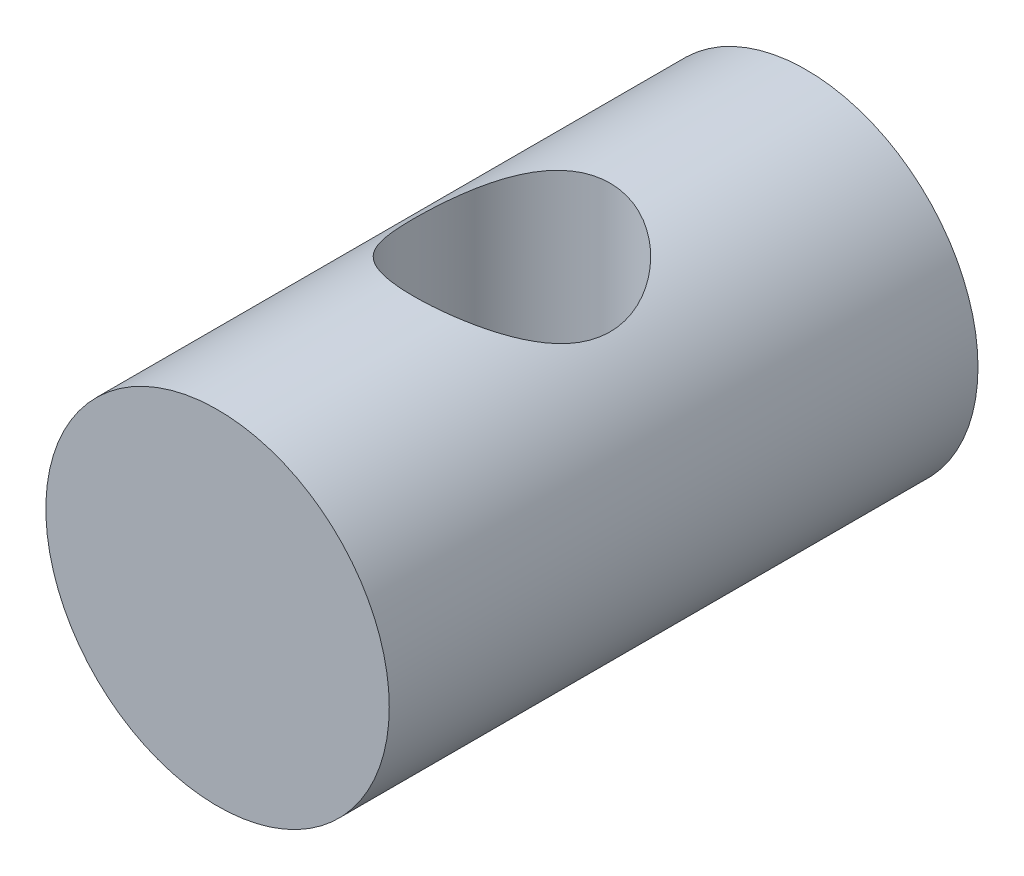
ISO-10303-21;
HEADER;
FILE_DESCRIPTION(('STEP AP214'),'2;1');
FILE_NAME('part.step','',(''),(''),'','','');
FILE_SCHEMA(('AUTOMOTIVE_DESIGN { 1 0 10303 214 1 1 1 1 }'));
ENDSEC;
DATA;
#1=APPLICATION_CONTEXT('core data for automotive mechanical design processes');
#2=APPLICATION_PROTOCOL_DEFINITION('international standard','automotive_design',2000,#1);
#3=PRODUCT_CONTEXT('',#1,'mechanical');
#4=PRODUCT('Part','Part','',(#3));
#5=PRODUCT_RELATED_PRODUCT_CATEGORY('part','',(#4));
#6=PRODUCT_DEFINITION_FORMATION('','',#4);
#7=PRODUCT_DEFINITION_CONTEXT('part definition',#1,'design');
#8=PRODUCT_DEFINITION('design','',#6,#7);
#9=PRODUCT_DEFINITION_SHAPE('','',#8);
#10=(LENGTH_UNIT() NAMED_UNIT(*) SI_UNIT(.MILLI.,.METRE.));
#11=(NAMED_UNIT(*) PLANE_ANGLE_UNIT() SI_UNIT($,.RADIAN.));
#12=(NAMED_UNIT(*) SI_UNIT($,.STERADIAN.) SOLID_ANGLE_UNIT());
#13=UNCERTAINTY_MEASURE_WITH_UNIT(LENGTH_MEASURE(1.E-05),#10,'distance_accuracy_value','');
#14=(GEOMETRIC_REPRESENTATION_CONTEXT(3) GLOBAL_UNCERTAINTY_ASSIGNED_CONTEXT((#13)) GLOBAL_UNIT_ASSIGNED_CONTEXT((#10,
#11,#12)) REPRESENTATION_CONTEXT('',''));
#15=CARTESIAN_POINT('',(0.,0.,0.));
#16=DIRECTION('',(0.,0.,1.));
#17=DIRECTION('',(1.,0.,0.));
#18=AXIS2_PLACEMENT_3D('',#15,#16,#17);
#19=CARTESIAN_POINT('',(0.,0.,0.));
#20=DIRECTION('',(0.,0.,-1.));
#21=DIRECTION('',(-1.,0.,0.));
#22=AXIS2_PLACEMENT_3D('',#19,#20,#21);
#23=PLANE('',#22);
#24=CARTESIAN_POINT('',(3.5,3.5,0.));
#25=DIRECTION('',(0.,0.,1.));
#26=DIRECTION('',(1.,0.,0.));
#27=AXIS2_PLACEMENT_3D('',#24,#25,#26);
#28=CIRCLE('',#27,3.5);
#29=CARTESIAN_POINT('',(7.,3.5,0.));
#30=VERTEX_POINT('',#29);
#31=EDGE_CURVE('E18',#30,#30,#28,.T.);
#32=ORIENTED_EDGE('',*,*,#31,.F.);
#33=EDGE_LOOP('',(#32));
#34=FACE_BOUND('',#33,.T.);
#35=ADVANCED_FACE('F15',(#34),#23,.T.);
#36=CARTESIAN_POINT('',(0.,0.,12.));
#37=DIRECTION('',(0.,0.,-1.));
#38=DIRECTION('',(-1.,0.,0.));
#39=AXIS2_PLACEMENT_3D('',#36,#37,#38);
#40=PLANE('',#39);
#41=CARTESIAN_POINT('',(3.5,3.5,12.));
#42=DIRECTION('',(0.,0.,1.));
#43=DIRECTION('',(1.,0.,0.));
#44=AXIS2_PLACEMENT_3D('',#41,#42,#43);
#45=CIRCLE('',#44,3.5);
#46=CARTESIAN_POINT('',(7.,3.5,12.));
#47=VERTEX_POINT('',#46);
#48=EDGE_CURVE('E22',#47,#47,#45,.F.);
#49=ORIENTED_EDGE('',*,*,#48,.F.);
#50=EDGE_LOOP('',(#49));
#51=FACE_BOUND('',#50,.T.);
#52=ADVANCED_FACE('F49',(#51),#40,.F.);
#53=CARTESIAN_POINT('',(3.5,0.,6.));
#54=DIRECTION('',(0.,1.,0.));
#55=DIRECTION('',(-1.,0.,0.));
#56=AXIS2_PLACEMENT_3D('',#53,#54,#55);
#57=CYLINDRICAL_SURFACE('',#56,2.);
#58=CARTESIAN_POINT('',(1.5,6.37228132326901,6.));
#59=CARTESIAN_POINT('',(1.50000204422436,6.37228454712099,5.89824071697675));
#60=CARTESIAN_POINT('',(1.50781480729771,6.37777067623112,5.79646672831802));
#61=CARTESIAN_POINT('',(1.53855068921281,6.39880046688832,5.59626540463563));
#62=CARTESIAN_POINT('',(1.561489919302,6.41435485184119,5.49784175574432));
#63=CARTESIAN_POINT('',(1.62103942346786,6.45309076236742,5.30762149928021));
#64=CARTESIAN_POINT('',(1.65756096882659,6.47622267211548,5.21578639695527));
#65=CARTESIAN_POINT('',(1.74295746322381,6.52742059167266,5.03958400081872));
#66=CARTESIAN_POINT('',(1.79183637209649,6.55548818220821,4.95521911251005));
#67=CARTESIAN_POINT('',(1.90682478661917,6.61712928824724,4.78618065877169));
#68=CARTESIAN_POINT('',(1.97423679288889,6.65096898375113,4.70248993469339));
#69=CARTESIAN_POINT('',(2.12169611861921,6.71820634481925,4.54680209211825));
#70=CARTESIAN_POINT('',(2.2017515979543,6.75160370971936,4.47481258668842));
#71=CARTESIAN_POINT('',(2.38145839728527,6.81796239643438,4.33783291507044));
#72=CARTESIAN_POINT('',(2.48224822167357,6.85058180751117,4.27415457176005));
#73=CARTESIAN_POINT('',(2.69532803941119,6.90802542898886,4.16511913000374));
#74=CARTESIAN_POINT('',(2.80760842968622,6.93285607930473,4.11974688674696));
#75=CARTESIAN_POINT('',(3.02998372064131,6.96996336372305,4.05286189960639));
#76=CARTESIAN_POINT('',(3.13939419402545,6.98315582593062,4.02959435836294));
#77=CARTESIAN_POINT('',(3.36128628788376,6.99901289726841,4.00169299604949));
#78=CARTESIAN_POINT('',(3.47376528230619,7.00168624068257,3.99704371572109));
#79=CARTESIAN_POINT('',(3.6849469637876,6.99652510240883,4.00608689983999));
#80=CARTESIAN_POINT('',(3.78377257716738,6.98984178265963,4.01776975643836));
#81=CARTESIAN_POINT('',(3.97777928272136,6.9686091056649,4.05539452444678));
#82=CARTESIAN_POINT('',(4.07296010622607,6.95405916973575,4.0813374848602));
#83=CARTESIAN_POINT('',(4.25817849675909,6.91820908135194,4.14665099229667));
#84=CARTESIAN_POINT('',(4.34816287736819,6.89685012587018,4.1861387474121));
#85=CARTESIAN_POINT('',(4.52037827753867,6.84915268765435,4.27711784116995));
#86=CARTESIAN_POINT('',(4.60260700085174,6.8228127370703,4.32861271923772));
#87=CARTESIAN_POINT('',(4.76692918495856,6.76394555274582,4.44874592127863));
#88=CARTESIAN_POINT('',(4.84795656029944,6.73105548059221,4.5186641582258));
#89=CARTESIAN_POINT('',(4.99778980682765,6.66439037140551,4.67033465934113));
#90=CARTESIAN_POINT('',(5.06658064643715,6.63061430362079,4.75210125765267));
#91=CARTESIAN_POINT('',(5.19686219905414,6.56212243151114,4.93488022288358));
#92=CARTESIAN_POINT('',(5.25694261459508,6.52764831081433,5.03699844156409));
#93=CARTESIAN_POINT('',(5.35868169503534,6.46628701949477,5.25207752591313));
#94=CARTESIAN_POINT('',(5.40037300071843,6.43938643675613,5.36501874323717));
#95=CARTESIAN_POINT('',(5.455874001455,6.40265362950898,5.57190959062671));
#96=CARTESIAN_POINT('',(5.47388069289566,6.39032428676995,5.66429134217347));
#97=CARTESIAN_POINT('',(5.49669026146642,6.37461858134697,5.85138817084493));
#98=CARTESIAN_POINT('',(5.50150579796718,6.37123363495883,5.94610092278013));
#99=CARTESIAN_POINT('',(5.49766863089417,6.37390377719123,6.13516343212116));
#100=CARTESIAN_POINT('',(5.48900796355997,6.37996444770089,6.22951294183307));
#101=CARTESIAN_POINT('',(5.45870152807443,6.40065746980172,6.41514959645774));
#102=CARTESIAN_POINT('',(5.43704629977864,6.41529606600908,6.50643445910858));
#103=CARTESIAN_POINT('',(5.38140846842958,6.45150911798998,6.68495328166673));
#104=CARTESIAN_POINT('',(5.34727488278457,6.47316813748298,6.77212219472486));
#105=CARTESIAN_POINT('',(5.2678570298669,6.52106419530222,6.9398419588285));
#106=CARTESIAN_POINT('',(5.2225682138661,6.54730309987681,7.02039009222811));
#107=CARTESIAN_POINT('',(5.11341400894957,6.60666399761926,7.18674731846636));
#108=CARTESIAN_POINT('',(5.047711996041,6.64020508074668,7.27120471486999));
#109=CARTESIAN_POINT('',(4.90365915117369,6.70718874482692,7.42868572125834));
#110=CARTESIAN_POINT('',(4.82529785443659,6.7406312207748,7.50169977238414));
#111=CARTESIAN_POINT('',(4.64867494696647,6.80761562311545,7.64147873905662));
#112=CARTESIAN_POINT('',(4.54920745926283,6.84083391107345,7.70689126341776));
#113=CARTESIAN_POINT('',(4.3385020489031,6.89983021540636,7.81965844723343));
#114=CARTESIAN_POINT('',(4.22727351775958,6.92561410793537,7.86702737792577));
#115=CARTESIAN_POINT('',(4.00569756822567,6.96494999115133,7.93821642470346));
#116=CARTESIAN_POINT('',(3.89601614617711,6.97932715272067,7.96364021417987));
#117=CARTESIAN_POINT('',(3.67311053252493,6.99749840717713,7.99566463319743));
#118=CARTESIAN_POINT('',(3.55988956247567,7.00130185566164,8.00228190282047));
#119=CARTESIAN_POINT('',(3.34733655361185,6.99809507365951,7.99666299303595));
#120=CARTESIAN_POINT('',(3.24792181893597,6.99229198229475,7.9865316276306));
#121=CARTESIAN_POINT('',(3.05248357562681,6.97266080925366,7.95181414035172));
#122=CARTESIAN_POINT('',(2.95646024505919,6.95883230686572,7.92722726068401));
#123=CARTESIAN_POINT('',(2.77005937308171,6.92435356756848,7.86463874091232));
#124=CARTESIAN_POINT('',(2.67969138830913,6.90369213555968,7.8266150788745));
#125=CARTESIAN_POINT('',(2.5065023650872,6.85723286822269,7.73850860831676));
#126=CARTESIAN_POINT('',(2.42368340065645,6.83143362749563,7.68842249944241));
#127=CARTESIAN_POINT('',(2.25817828832372,6.77358852163637,7.5713852762283));
#128=CARTESIAN_POINT('',(2.17650677822627,6.74116776373342,7.50318571721369));
#129=CARTESIAN_POINT('',(2.0251097769588,6.67514349361031,7.35496930487775));
#130=CARTESIAN_POINT('',(1.95539875065058,6.64153860767596,7.27493835746265));
#131=CARTESIAN_POINT('',(1.82253955101245,6.57282960146827,7.09538698398312));
#132=CARTESIAN_POINT('',(1.76084083878918,6.53793640760435,6.99470355515741));
#133=CARTESIAN_POINT('',(1.65555350731888,6.47519675497847,6.78230817199374));
#134=CARTESIAN_POINT('',(1.61193523229337,6.44733878651354,6.67061465210016));
#135=CARTESIAN_POINT('',(1.55276863796529,6.4084776323925,6.46572576098033));
#136=CARTESIAN_POINT('',(1.53307181655259,6.39507162454789,6.3741836596729));
#137=CARTESIAN_POINT('',(1.50669262433316,6.37697604487482,6.18843019166413));
#138=CARTESIAN_POINT('',(1.49999810720285,6.37227833822592,6.09422139966692));
#139=CARTESIAN_POINT('',(1.5,6.37228132326901,6.));
#140=B_SPLINE_CURVE_WITH_KNOTS('',3,(#58,#59,#60,#61,#62,#63,#64,#65,#66,#67,#68,#69,#70,#71,
#72,#73,#74,#75,#76,#77,#78,#79,#80,#81,#82,#83,#84,#85,#86,#87,#88,#89,#90,#91,#92,#93,#94,#95,
#96,#97,#98,#99,#100,#101,#102,#103,#104,#105,#106,#107,#108,#109,#110,#111,#112,#113,#114,#115,
#116,#117,#118,#119,#120,#121,#122,#123,#124,#125,#126,#127,#128,#129,#130,#131,#132,#133,#134,
#135,#136,#137,#138,#139),.UNSPECIFIED.,.T.,.F.,(4,2,2,2,2,2,2,2,2,2,2,2,2,2,2,2,2,2,2,2,2,2,2,
2,2,2,2,2,2,2,2,2,2,2,2,2,2,2,2,2,4),(0.,0.304883874922046,0.610093008270222,0.913342368040703,
1.21668902547472,1.55333694497106,1.89020302568346,2.25902542597166,2.62754206720092,
2.96347760859663,3.29913415548684,3.59693222043896,3.89475219497793,4.1952171976663,
4.49577088279065,4.83030033345032,5.16523793001608,5.53354788734202,5.90120143518938,
6.18472748221689,6.46798133769669,6.75140264557764,7.03503053719285,7.32221037238044,
7.60950750428143,7.944568532569,8.27990796934229,8.64873850633052,9.01727671507228,
9.35580044793154,9.69402456028398,9.99288076018055,10.291752628263,10.591116615435,
10.8905626035456,11.222913671625,11.5556638903259,11.9232239861485,12.2901787962962,
12.572742293729,12.8550417024667),.UNSPECIFIED.);
#141=CARTESIAN_POINT('',(1.5,6.37228132326901,6.));
#142=VERTEX_POINT('',#141);
#143=EDGE_CURVE('E10',#142,#142,#140,.T.);
#144=ORIENTED_EDGE('',*,*,#143,.F.);
#145=EDGE_LOOP('',(#144));
#146=FACE_BOUND('',#145,.T.);
#147=CARTESIAN_POINT('',(1.5,0.627718676730986,6.));
#148=CARTESIAN_POINT('',(1.50000204422436,0.627715452879011,6.10175928302324));
#149=CARTESIAN_POINT('',(1.50781480729771,0.622229323768883,6.20353327168198));
#150=CARTESIAN_POINT('',(1.53855068921281,0.601199533111684,6.40373459536437));
#151=CARTESIAN_POINT('',(1.561489919302,0.585645148158808,6.50215824425567));
#152=CARTESIAN_POINT('',(1.62103942346786,0.546909237632575,6.69237850071979));
#153=CARTESIAN_POINT('',(1.65756096882659,0.523777327884521,6.78421360304473));
#154=CARTESIAN_POINT('',(1.74295746322381,0.472579408327338,6.96041599918128));
#155=CARTESIAN_POINT('',(1.7918363720965,0.444511817791786,7.04478088748995));
#156=CARTESIAN_POINT('',(1.90682478661917,0.382870711752763,7.21381934122831));
#157=CARTESIAN_POINT('',(1.9742367928889,0.349031016248865,7.29751006530661));
#158=CARTESIAN_POINT('',(2.12169611861921,0.281793655180749,7.45319790788175));
#159=CARTESIAN_POINT('',(2.2017515979543,0.248396290280642,7.52518741331158));
#160=CARTESIAN_POINT('',(2.38145839728527,0.182037603565623,7.66216708492956));
#161=CARTESIAN_POINT('',(2.48224822167357,0.149418192488832,7.72584542823994));
#162=CARTESIAN_POINT('',(2.69532803941119,0.0919745710111408,7.83488086999626));
#163=CARTESIAN_POINT('',(2.80760842968622,0.0671439206952661,7.88025311325304));
#164=CARTESIAN_POINT('',(3.02998372064131,0.0300366362769491,7.94713810039361));
#165=CARTESIAN_POINT('',(3.13939419402545,0.0168441740693796,7.97040564163706));
#166=CARTESIAN_POINT('',(3.36128628788376,0.0009871027315897,7.99830700395052));
#167=CARTESIAN_POINT('',(3.47376528230619,-0.00168624068257116,8.00295628427891));
#168=CARTESIAN_POINT('',(3.6849469637876,0.00347489759117274,7.99391310016001));
#169=CARTESIAN_POINT('',(3.78377257716738,0.0101582173403684,7.98223024356164));
#170=CARTESIAN_POINT('',(3.97777928272136,0.0313908943351044,7.94460547555322));
#171=CARTESIAN_POINT('',(4.07296010622607,0.0459408302642527,7.9186625151398));
#172=CARTESIAN_POINT('',(4.25817849675909,0.0817909186480617,7.85334900770332));
#173=CARTESIAN_POINT('',(4.34816287736819,0.103149874129818,7.8138612525879));
#174=CARTESIAN_POINT('',(4.52037827753867,0.150847312345655,7.72288215883005));
#175=CARTESIAN_POINT('',(4.60260700085174,0.1771872629297,7.67138728076228));
#176=CARTESIAN_POINT('',(4.76692918495856,0.236054447254184,7.55125407872137));
#177=CARTESIAN_POINT('',(4.84795656029944,0.268944519407786,7.4813358417742));
#178=CARTESIAN_POINT('',(4.99778980682765,0.335609628594487,7.32966534065887));
#179=CARTESIAN_POINT('',(5.06658064643715,0.369385696379208,7.24789874234733));
#180=CARTESIAN_POINT('',(5.19686219905414,0.437877568488861,7.06511977711642));
#181=CARTESIAN_POINT('',(5.25694261459508,0.472351689185667,6.96300155843591));
#182=CARTESIAN_POINT('',(5.35868169503534,0.533712980505228,6.74792247408687));
#183=CARTESIAN_POINT('',(5.40037300071843,0.560613563243871,6.63498125676283));
#184=CARTESIAN_POINT('',(5.455874001455,0.59734637049102,6.42809040937329));
#185=CARTESIAN_POINT('',(5.47388069289566,0.609675713230048,6.33570865782653));
#186=CARTESIAN_POINT('',(5.49669026146642,0.625381418653033,6.14861182915507));
#187=CARTESIAN_POINT('',(5.50150579796718,0.628766365041171,6.05389907721987));
#188=CARTESIAN_POINT('',(5.49766863089417,0.626096222808775,5.86483656787885));
#189=CARTESIAN_POINT('',(5.48900796355997,0.62003555229911,5.77048705816694));
#190=CARTESIAN_POINT('',(5.45870152807444,0.599342530198279,5.58485040354226));
#191=CARTESIAN_POINT('',(5.43704629977864,0.584703933990925,5.49356554089142));
#192=CARTESIAN_POINT('',(5.38140846842958,0.548490882010025,5.31504671833327));
#193=CARTESIAN_POINT('',(5.34727488278457,0.526831862517016,5.22787780527515));
#194=CARTESIAN_POINT('',(5.2678570298669,0.478935804697783,5.0601580411715));
#195=CARTESIAN_POINT('',(5.2225682138661,0.452696900123188,4.97960990777189));
#196=CARTESIAN_POINT('',(5.11341400894957,0.393336002380737,4.81325268153364));
#197=CARTESIAN_POINT('',(5.047711996041,0.359794919253318,4.72879528513001));
#198=CARTESIAN_POINT('',(4.90365915117369,0.292811255173081,4.57131427874166));
#199=CARTESIAN_POINT('',(4.82529785443659,0.2593687792252,4.49830022761586));
#200=CARTESIAN_POINT('',(4.64867494696647,0.192384376884551,4.35852126094338));
#201=CARTESIAN_POINT('',(4.54920745926284,0.159166088926553,4.29310873658225));
#202=CARTESIAN_POINT('',(4.3385020489031,0.100169784593638,4.18034155276657));
#203=CARTESIAN_POINT('',(4.22727351775958,0.0743858920646283,4.13297262207423));
#204=CARTESIAN_POINT('',(4.00569756822568,0.0350500088486742,4.06178357529654));
#205=CARTESIAN_POINT('',(3.89601614617712,0.0206728472793273,4.03635978582013));
#206=CARTESIAN_POINT('',(3.67311053252493,0.0025015928228664,4.00433536680257));
#207=CARTESIAN_POINT('',(3.55988956247568,-0.00130185566163553,3.99771809717953));
#208=CARTESIAN_POINT('',(3.34733655361186,0.00190492634048564,4.00333700696405));
#209=CARTESIAN_POINT('',(3.24792181893598,0.00770801770524531,4.0134683723694));
#210=CARTESIAN_POINT('',(3.05248357562682,0.0273391907463358,4.04818585964827));
#211=CARTESIAN_POINT('',(2.95646024505919,0.0411676931342755,4.07277273931599));
#212=CARTESIAN_POINT('',(2.77005937308171,0.0756464324315167,4.13536125908768));
#213=CARTESIAN_POINT('',(2.67969138830914,0.0963078644403169,4.1733849211255));
#214=CARTESIAN_POINT('',(2.50650236508721,0.142767131777314,4.26149139168324));
#215=CARTESIAN_POINT('',(2.42368340065646,0.168566372504373,4.31157750055759));
#216=CARTESIAN_POINT('',(2.25817828832372,0.226411478363626,4.4286147237717));
#217=CARTESIAN_POINT('',(2.17650677822627,0.258832236266575,4.49681428278631));
#218=CARTESIAN_POINT('',(2.0251097769588,0.324856506389687,4.64503069512225));
#219=CARTESIAN_POINT('',(1.95539875065058,0.358461392324041,4.72506164253735));
#220=CARTESIAN_POINT('',(1.82253955101245,0.427170398531734,4.90461301601688));
#221=CARTESIAN_POINT('',(1.76084083878918,0.462063592395646,5.00529644484259));
#222=CARTESIAN_POINT('',(1.65555350731888,0.524803245021524,5.21769182800626));
#223=CARTESIAN_POINT('',(1.61193523229338,0.552661213486455,5.32938534789984));
#224=CARTESIAN_POINT('',(1.55276863796529,0.591522367607497,5.53427423901967));
#225=CARTESIAN_POINT('',(1.53307181655259,0.604928375452112,5.6258163403271));
#226=CARTESIAN_POINT('',(1.50669262433316,0.623023955125178,5.81156980833587));
#227=CARTESIAN_POINT('',(1.49999810720285,0.627721661774084,5.90577860033308));
#228=CARTESIAN_POINT('',(1.5,0.627718676730986,6.));
#229=B_SPLINE_CURVE_WITH_KNOTS('',3,(#147,#148,#149,#150,#151,#152,#153,#154,#155,#156,#157,
#158,#159,#160,#161,#162,#163,#164,#165,#166,#167,#168,#169,#170,#171,#172,#173,#174,#175,#176,
#177,#178,#179,#180,#181,#182,#183,#184,#185,#186,#187,#188,#189,#190,#191,#192,#193,#194,#195,
#196,#197,#198,#199,#200,#201,#202,#203,#204,#205,#206,#207,#208,#209,#210,#211,#212,#213,#214,
#215,#216,#217,#218,#219,#220,#221,#222,#223,#224,#225,#226,#227,#228),.UNSPECIFIED.,.T.,.F.,(4,
2,2,2,2,2,2,2,2,2,2,2,2,2,2,2,2,2,2,2,2,2,2,2,2,2,2,2,2,2,2,2,2,2,2,2,2,2,2,2,4),(0.,
0.304883874922045,0.610093008270222,0.913342368040702,1.21668902547472,1.55333694497106,
1.89020302568346,2.25902542597166,2.62754206720092,2.96347760859663,3.29913415548684,
3.59693222043896,3.89475219497793,4.1952171976663,4.49577088279065,4.83030033345033,
5.16523793001608,5.53354788734201,5.90120143518939,6.18472748221689,6.46798133769669,
6.75140264557764,7.03503053719285,7.32221037238044,7.60950750428143,7.944568532569,
8.27990796934229,8.64873850633052,9.01727671507228,9.35580044793154,9.69402456028398,
9.99288076018055,10.291752628263,10.591116615435,10.8905626035456,11.222913671625,
11.5556638903259,11.9232239861485,12.2901787962962,12.572742293729,12.8550417024667),.UNSPECIFIED.);
#230=CARTESIAN_POINT('',(1.5,0.627718676730986,6.));
#231=VERTEX_POINT('',#230);
#232=EDGE_CURVE('E27',#231,#231,#229,.T.);
#233=ORIENTED_EDGE('',*,*,#232,.F.);
#234=EDGE_LOOP('',(#233));
#235=FACE_BOUND('',#234,.T.);
#236=ADVANCED_FACE('F33',(#146,#235),#57,.F.);
#237=CARTESIAN_POINT('',(3.5,3.5,0.));
#238=DIRECTION('',(0.,0.,1.));
#239=DIRECTION('',(1.,0.,0.));
#240=AXIS2_PLACEMENT_3D('',#237,#238,#239);
#241=CYLINDRICAL_SURFACE('',#240,3.5);
#242=ORIENTED_EDGE('',*,*,#143,.T.);
#243=EDGE_LOOP('',(#242));
#244=FACE_BOUND('',#243,.T.);
#245=ORIENTED_EDGE('',*,*,#48,.T.);
#246=EDGE_LOOP('',(#245));
#247=FACE_BOUND('',#246,.T.);
#248=ORIENTED_EDGE('',*,*,#232,.T.);
#249=EDGE_LOOP('',(#248));
#250=FACE_BOUND('',#249,.T.);
#251=ORIENTED_EDGE('',*,*,#31,.T.);
#252=EDGE_LOOP('',(#251));
#253=FACE_BOUND('',#252,.T.);
#254=ADVANCED_FACE('F35',(#244,#247,#250,#253),#241,.T.);
#255=CLOSED_SHELL('',(#35,#52,#236,#254));
#256=MANIFOLD_SOLID_BREP('B1',#255);
#257=ADVANCED_BREP_SHAPE_REPRESENTATION('',(#18,#256),#14);
#258=SHAPE_DEFINITION_REPRESENTATION(#9,#257);
ENDSEC;
END-ISO-10303-21;
